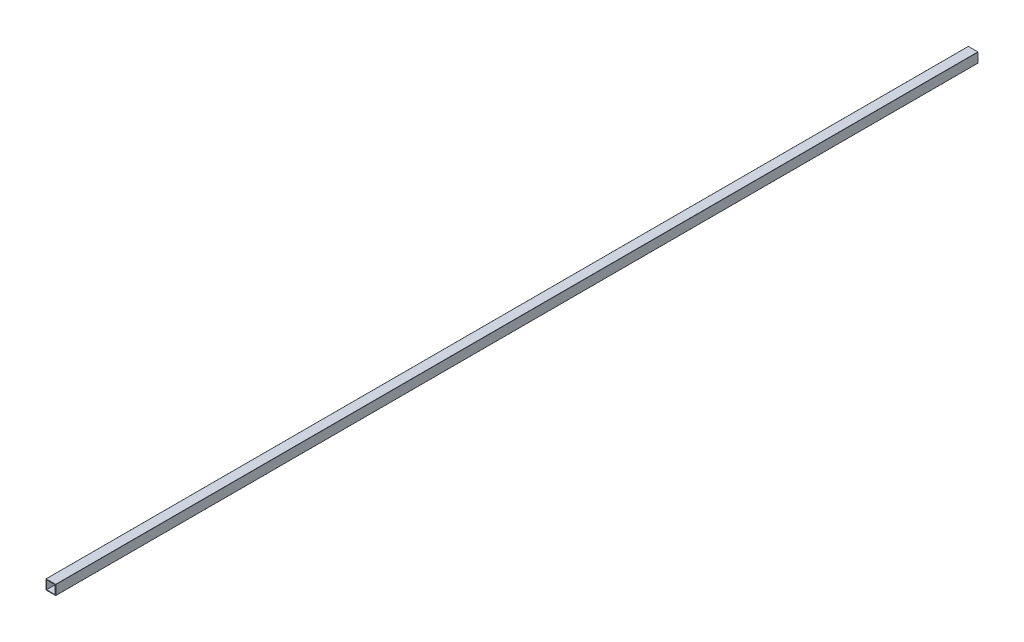
ISO-10303-21;
HEADER;
FILE_DESCRIPTION(('STEP AP214'),'2;1');
FILE_NAME('part.step','',(''),(''),'','','');
FILE_SCHEMA(('AUTOMOTIVE_DESIGN { 1 0 10303 214 1 1 1 1 }'));
ENDSEC;
DATA;
#1=APPLICATION_CONTEXT('core data for automotive mechanical design processes');
#2=APPLICATION_PROTOCOL_DEFINITION('international standard','automotive_design',2000,#1);
#3=PRODUCT_CONTEXT('',#1,'mechanical');
#4=PRODUCT('Part','Part','',(#3));
#5=PRODUCT_RELATED_PRODUCT_CATEGORY('part','',(#4));
#6=PRODUCT_DEFINITION_FORMATION('','',#4);
#7=PRODUCT_DEFINITION_CONTEXT('part definition',#1,'design');
#8=PRODUCT_DEFINITION('design','',#6,#7);
#9=PRODUCT_DEFINITION_SHAPE('','',#8);
#10=(LENGTH_UNIT() NAMED_UNIT(*) SI_UNIT(.MILLI.,.METRE.));
#11=(NAMED_UNIT(*) PLANE_ANGLE_UNIT() SI_UNIT($,.RADIAN.));
#12=(NAMED_UNIT(*) SI_UNIT($,.STERADIAN.) SOLID_ANGLE_UNIT());
#13=UNCERTAINTY_MEASURE_WITH_UNIT(LENGTH_MEASURE(1.E-05),#10,'distance_accuracy_value','');
#14=(GEOMETRIC_REPRESENTATION_CONTEXT(3) GLOBAL_UNCERTAINTY_ASSIGNED_CONTEXT((#13)) GLOBAL_UNIT_ASSIGNED_CONTEXT((#10,
#11,#12)) REPRESENTATION_CONTEXT('',''));
#15=CARTESIAN_POINT('',(0.,0.,0.));
#16=DIRECTION('',(0.,0.,1.));
#17=DIRECTION('',(1.,0.,0.));
#18=AXIS2_PLACEMENT_3D('',#15,#16,#17);
#19=CARTESIAN_POINT('',(30.75,30.75,6000.));
#20=DIRECTION('',(0.,0.,-1.));
#21=DIRECTION('',(-1.,0.,0.));
#22=AXIS2_PLACEMENT_3D('',#19,#20,#21);
#23=PLANE('',#22);
#24=CARTESIAN_POINT('',(30.75,30.75,6000.));
#25=DIRECTION('',(0.,0.,1.));
#26=DIRECTION('',(-1.,0.,0.));
#27=AXIS2_PLACEMENT_3D('',#24,#25,#26);
#28=CIRCLE('',#27,1.);
#29=CARTESIAN_POINT('',(31.75,30.75,6000.));
#30=VERTEX_POINT('',#29);
#31=CARTESIAN_POINT('',(30.75,31.75,6000.));
#32=VERTEX_POINT('',#31);
#33=EDGE_CURVE('E158',#30,#32,#28,.T.);
#34=ORIENTED_EDGE('',*,*,#33,.T.);
#35=DIRECTION('',(-1.,0.,0.));
#36=VECTOR('',#35,1.);
#37=CARTESIAN_POINT('',(-30.75,31.75,6000.));
#38=LINE('',#37,#36);
#39=CARTESIAN_POINT('',(-30.75,31.75,6000.));
#40=VERTEX_POINT('',#39);
#41=EDGE_CURVE('E161',#32,#40,#38,.T.);
#42=ORIENTED_EDGE('',*,*,#41,.T.);
#43=CARTESIAN_POINT('',(-30.75,30.75,6000.));
#44=DIRECTION('',(0.,0.,1.));
#45=DIRECTION('',(-1.,0.,0.));
#46=AXIS2_PLACEMENT_3D('',#43,#44,#45);
#47=CIRCLE('',#46,1.);
#48=CARTESIAN_POINT('',(-31.75,30.75,6000.));
#49=VERTEX_POINT('',#48);
#50=EDGE_CURVE('E164',#40,#49,#47,.T.);
#51=ORIENTED_EDGE('',*,*,#50,.T.);
#52=DIRECTION('',(0.,-1.,0.));
#53=VECTOR('',#52,1.);
#54=CARTESIAN_POINT('',(-31.75,-30.75,6000.));
#55=LINE('',#54,#53);
#56=CARTESIAN_POINT('',(-31.75,-30.75,6000.));
#57=VERTEX_POINT('',#56);
#58=EDGE_CURVE('E166',#49,#57,#55,.T.);
#59=ORIENTED_EDGE('',*,*,#58,.T.);
#60=CARTESIAN_POINT('',(-30.75,-30.75,6000.));
#61=DIRECTION('',(0.,0.,1.));
#62=DIRECTION('',(-1.,0.,0.));
#63=AXIS2_PLACEMENT_3D('',#60,#61,#62);
#64=CIRCLE('',#63,1.);
#65=CARTESIAN_POINT('',(-30.75,-31.75,6000.));
#66=VERTEX_POINT('',#65);
#67=EDGE_CURVE('E168',#57,#66,#64,.T.);
#68=ORIENTED_EDGE('',*,*,#67,.T.);
#69=DIRECTION('',(1.,0.,0.));
#70=VECTOR('',#69,1.);
#71=CARTESIAN_POINT('',(-30.75,-31.75,6000.));
#72=LINE('',#71,#70);
#73=CARTESIAN_POINT('',(30.75,-31.75,6000.));
#74=VERTEX_POINT('',#73);
#75=EDGE_CURVE('E170',#66,#74,#72,.T.);
#76=ORIENTED_EDGE('',*,*,#75,.T.);
#77=CARTESIAN_POINT('',(30.75,-30.75,6000.));
#78=DIRECTION('',(0.,0.,1.));
#79=DIRECTION('',(1.,0.,0.));
#80=AXIS2_PLACEMENT_3D('',#77,#78,#79);
#81=CIRCLE('',#80,1.);
#82=CARTESIAN_POINT('',(31.75,-30.75,6000.));
#83=VERTEX_POINT('',#82);
#84=EDGE_CURVE('E172',#74,#83,#81,.T.);
#85=ORIENTED_EDGE('',*,*,#84,.T.);
#86=DIRECTION('',(0.,1.,0.));
#87=VECTOR('',#86,1.);
#88=CARTESIAN_POINT('',(31.75,-30.75,6000.));
#89=LINE('',#88,#87);
#90=EDGE_CURVE('E174',#83,#30,#89,.T.);
#91=ORIENTED_EDGE('',*,*,#90,.T.);
#92=EDGE_LOOP('',(#34,#42,#51,#59,#68,#76,#85,#91));
#93=FACE_BOUND('',#92,.T.);
#94=DIRECTION('',(1.,0.,0.));
#95=VECTOR('',#94,1.);
#96=CARTESIAN_POINT('',(-27.95,-27.95,6000.));
#97=LINE('',#96,#95);
#98=CARTESIAN_POINT('',(-27.95,-27.95,6000.));
#99=VERTEX_POINT('',#98);
#100=CARTESIAN_POINT('',(27.95,-27.95,6000.));
#101=VERTEX_POINT('',#100);
#102=EDGE_CURVE('E122',#99,#101,#97,.T.);
#103=ORIENTED_EDGE('',*,*,#102,.F.);
#104=DIRECTION('',(0.,-1.,0.));
#105=VECTOR('',#104,1.);
#106=CARTESIAN_POINT('',(-27.95,-27.95,6000.));
#107=LINE('',#106,#105);
#108=CARTESIAN_POINT('',(-27.95,27.95,6000.));
#109=VERTEX_POINT('',#108);
#110=EDGE_CURVE('E144',#109,#99,#107,.T.);
#111=ORIENTED_EDGE('',*,*,#110,.F.);
#112=DIRECTION('',(-1.,0.,0.));
#113=VECTOR('',#112,1.);
#114=CARTESIAN_POINT('',(-27.95,27.95,6000.));
#115=LINE('',#114,#113);
#116=CARTESIAN_POINT('',(27.95,27.95,6000.));
#117=VERTEX_POINT('',#116);
#118=EDGE_CURVE('E142',#117,#109,#115,.T.);
#119=ORIENTED_EDGE('',*,*,#118,.F.);
#120=DIRECTION('',(0.,1.,0.));
#121=VECTOR('',#120,1.);
#122=CARTESIAN_POINT('',(27.95,-27.95,6000.));
#123=LINE('',#122,#121);
#124=EDGE_CURVE('E130',#101,#117,#123,.T.);
#125=ORIENTED_EDGE('',*,*,#124,.F.);
#126=EDGE_LOOP('',(#103,#111,#119,#125));
#127=FACE_BOUND('',#126,.T.);
#128=ADVANCED_FACE('F33',(#93,#127),#23,.F.);
#129=CARTESIAN_POINT('',(30.75,30.75,0.));
#130=DIRECTION('',(0.,0.,-1.));
#131=DIRECTION('',(-1.,0.,0.));
#132=AXIS2_PLACEMENT_3D('',#129,#130,#131);
#133=PLANE('',#132);
#134=CARTESIAN_POINT('',(30.75,30.75,0.));
#135=DIRECTION('',(0.,0.,1.));
#136=DIRECTION('',(-1.,0.,0.));
#137=AXIS2_PLACEMENT_3D('',#134,#135,#136);
#138=CIRCLE('',#137,1.);
#139=CARTESIAN_POINT('',(31.75,30.75,0.));
#140=VERTEX_POINT('',#139);
#141=CARTESIAN_POINT('',(30.75,31.75,0.));
#142=VERTEX_POINT('',#141);
#143=EDGE_CURVE('E138',#140,#142,#138,.T.);
#144=ORIENTED_EDGE('',*,*,#143,.F.);
#145=DIRECTION('',(0.,1.,0.));
#146=VECTOR('',#145,1.);
#147=CARTESIAN_POINT('',(31.75,-30.75,0.));
#148=LINE('',#147,#146);
#149=CARTESIAN_POINT('',(31.75,-30.75,0.));
#150=VERTEX_POINT('',#149);
#151=EDGE_CURVE('E162',#150,#140,#148,.T.);
#152=ORIENTED_EDGE('',*,*,#151,.F.);
#153=CARTESIAN_POINT('',(30.75,-30.75,0.));
#154=DIRECTION('',(0.,0.,1.));
#155=DIRECTION('',(1.,0.,0.));
#156=AXIS2_PLACEMENT_3D('',#153,#154,#155);
#157=CIRCLE('',#156,1.);
#158=CARTESIAN_POINT('',(30.75,-31.75,0.));
#159=VERTEX_POINT('',#158);
#160=EDGE_CURVE('E189',#159,#150,#157,.T.);
#161=ORIENTED_EDGE('',*,*,#160,.F.);
#162=DIRECTION('',(1.,0.,0.));
#163=VECTOR('',#162,1.);
#164=CARTESIAN_POINT('',(-30.75,-31.75,0.));
#165=LINE('',#164,#163);
#166=CARTESIAN_POINT('',(-30.75,-31.75,0.));
#167=VERTEX_POINT('',#166);
#168=EDGE_CURVE('E187',#167,#159,#165,.T.);
#169=ORIENTED_EDGE('',*,*,#168,.F.);
#170=CARTESIAN_POINT('',(-30.75,-30.75,0.));
#171=DIRECTION('',(0.,0.,1.));
#172=DIRECTION('',(-1.,0.,0.));
#173=AXIS2_PLACEMENT_3D('',#170,#171,#172);
#174=CIRCLE('',#173,1.);
#175=CARTESIAN_POINT('',(-31.75,-30.75,0.));
#176=VERTEX_POINT('',#175);
#177=EDGE_CURVE('E185',#176,#167,#174,.T.);
#178=ORIENTED_EDGE('',*,*,#177,.F.);
#179=DIRECTION('',(0.,-1.,0.));
#180=VECTOR('',#179,1.);
#181=CARTESIAN_POINT('',(-31.75,-30.75,0.));
#182=LINE('',#181,#180);
#183=CARTESIAN_POINT('',(-31.75,30.75,0.));
#184=VERTEX_POINT('',#183);
#185=EDGE_CURVE('E183',#184,#176,#182,.T.);
#186=ORIENTED_EDGE('',*,*,#185,.F.);
#187=CARTESIAN_POINT('',(-30.75,30.75,0.));
#188=DIRECTION('',(0.,0.,1.));
#189=DIRECTION('',(-1.,0.,0.));
#190=AXIS2_PLACEMENT_3D('',#187,#188,#189);
#191=CIRCLE('',#190,1.);
#192=CARTESIAN_POINT('',(-30.75,31.75,0.));
#193=VERTEX_POINT('',#192);
#194=EDGE_CURVE('E181',#193,#184,#191,.T.);
#195=ORIENTED_EDGE('',*,*,#194,.F.);
#196=DIRECTION('',(-1.,0.,0.));
#197=VECTOR('',#196,1.);
#198=CARTESIAN_POINT('',(-30.75,31.75,0.));
#199=LINE('',#198,#197);
#200=EDGE_CURVE('E179',#142,#193,#199,.T.);
#201=ORIENTED_EDGE('',*,*,#200,.F.);
#202=EDGE_LOOP('',(#144,#152,#161,#169,#178,#186,#195,#201));
#203=FACE_BOUND('',#202,.T.);
#204=DIRECTION('',(0.,-1.,0.));
#205=VECTOR('',#204,1.);
#206=CARTESIAN_POINT('',(-27.95,-27.95,0.));
#207=LINE('',#206,#205);
#208=CARTESIAN_POINT('',(-27.95,27.95,0.));
#209=VERTEX_POINT('',#208);
#210=CARTESIAN_POINT('',(-27.95,-27.95,0.));
#211=VERTEX_POINT('',#210);
#212=EDGE_CURVE('E131',#209,#211,#207,.T.);
#213=ORIENTED_EDGE('',*,*,#212,.T.);
#214=DIRECTION('',(1.,0.,0.));
#215=VECTOR('',#214,1.);
#216=CARTESIAN_POINT('',(-27.95,-27.95,0.));
#217=LINE('',#216,#215);
#218=CARTESIAN_POINT('',(27.95,-27.95,0.));
#219=VERTEX_POINT('',#218);
#220=EDGE_CURVE('E56',#211,#219,#217,.T.);
#221=ORIENTED_EDGE('',*,*,#220,.T.);
#222=DIRECTION('',(0.,1.,0.));
#223=VECTOR('',#222,1.);
#224=CARTESIAN_POINT('',(27.95,-27.95,0.));
#225=LINE('',#224,#223);
#226=CARTESIAN_POINT('',(27.95,27.95,0.));
#227=VERTEX_POINT('',#226);
#228=EDGE_CURVE('E137',#219,#227,#225,.T.);
#229=ORIENTED_EDGE('',*,*,#228,.T.);
#230=DIRECTION('',(-1.,0.,0.));
#231=VECTOR('',#230,1.);
#232=CARTESIAN_POINT('',(-27.95,27.95,0.));
#233=LINE('',#232,#231);
#234=EDGE_CURVE('E150',#227,#209,#233,.T.);
#235=ORIENTED_EDGE('',*,*,#234,.T.);
#236=EDGE_LOOP('',(#213,#221,#229,#235));
#237=FACE_BOUND('',#236,.T.);
#238=ADVANCED_FACE('F219',(#203,#237),#133,.T.);
#239=CARTESIAN_POINT('',(30.75,30.75,6000.));
#240=DIRECTION('',(0.,0.,-1.));
#241=DIRECTION('',(-1.,0.,0.));
#242=AXIS2_PLACEMENT_3D('',#239,#240,#241);
#243=CYLINDRICAL_SURFACE('',#242,1.);
#244=ORIENTED_EDGE('',*,*,#143,.T.);
#245=DIRECTION('',(0.,0.,-1.));
#246=VECTOR('',#245,1.);
#247=CARTESIAN_POINT('',(30.75,31.75,6000.));
#248=LINE('',#247,#246);
#249=EDGE_CURVE('E11',#32,#142,#248,.T.);
#250=ORIENTED_EDGE('',*,*,#249,.F.);
#251=ORIENTED_EDGE('',*,*,#33,.F.);
#252=DIRECTION('',(0.,0.,-1.));
#253=VECTOR('',#252,1.);
#254=CARTESIAN_POINT('',(31.75,30.75,6000.));
#255=LINE('',#254,#253);
#256=EDGE_CURVE('E176',#30,#140,#255,.T.);
#257=ORIENTED_EDGE('',*,*,#256,.T.);
#258=EDGE_LOOP('',(#244,#250,#251,#257));
#259=FACE_BOUND('',#258,.T.);
#260=ADVANCED_FACE('F35',(#259),#243,.T.);
#261=CARTESIAN_POINT('',(-30.75,31.75,6000.));
#262=DIRECTION('',(0.,-1.,0.));
#263=DIRECTION('',(0.,0.,-1.));
#264=AXIS2_PLACEMENT_3D('',#261,#262,#263);
#265=PLANE('',#264);
#266=ORIENTED_EDGE('',*,*,#200,.T.);
#267=DIRECTION('',(0.,0.,-1.));
#268=VECTOR('',#267,1.);
#269=CARTESIAN_POINT('',(-30.75,31.75,6000.));
#270=LINE('',#269,#268);
#271=EDGE_CURVE('E41',#40,#193,#270,.T.);
#272=ORIENTED_EDGE('',*,*,#271,.F.);
#273=ORIENTED_EDGE('',*,*,#41,.F.);
#274=ORIENTED_EDGE('',*,*,#249,.T.);
#275=EDGE_LOOP('',(#266,#272,#273,#274));
#276=FACE_BOUND('',#275,.T.);
#277=ADVANCED_FACE('F236',(#276),#265,.F.);
#278=CARTESIAN_POINT('',(-30.75,30.75,6000.));
#279=DIRECTION('',(0.,0.,-1.));
#280=DIRECTION('',(-1.,0.,0.));
#281=AXIS2_PLACEMENT_3D('',#278,#279,#280);
#282=CYLINDRICAL_SURFACE('',#281,1.);
#283=ORIENTED_EDGE('',*,*,#194,.T.);
#284=DIRECTION('',(0.,0.,-1.));
#285=VECTOR('',#284,1.);
#286=CARTESIAN_POINT('',(-31.75,30.75,6000.));
#287=LINE('',#286,#285);
#288=EDGE_CURVE('E206',#49,#184,#287,.T.);
#289=ORIENTED_EDGE('',*,*,#288,.F.);
#290=ORIENTED_EDGE('',*,*,#50,.F.);
#291=ORIENTED_EDGE('',*,*,#271,.T.);
#292=EDGE_LOOP('',(#283,#289,#290,#291));
#293=FACE_BOUND('',#292,.T.);
#294=ADVANCED_FACE('F213',(#293),#282,.T.);
#295=CARTESIAN_POINT('',(-31.75,-30.75,6000.));
#296=DIRECTION('',(1.,0.,0.));
#297=DIRECTION('',(0.,0.,-1.));
#298=AXIS2_PLACEMENT_3D('',#295,#296,#297);
#299=PLANE('',#298);
#300=ORIENTED_EDGE('',*,*,#185,.T.);
#301=DIRECTION('',(0.,0.,-1.));
#302=VECTOR('',#301,1.);
#303=CARTESIAN_POINT('',(-31.75,-30.75,6000.));
#304=LINE('',#303,#302);
#305=EDGE_CURVE('E203',#57,#176,#304,.T.);
#306=ORIENTED_EDGE('',*,*,#305,.F.);
#307=ORIENTED_EDGE('',*,*,#58,.F.);
#308=ORIENTED_EDGE('',*,*,#288,.T.);
#309=EDGE_LOOP('',(#300,#306,#307,#308));
#310=FACE_BOUND('',#309,.T.);
#311=ADVANCED_FACE('F225',(#310),#299,.F.);
#312=CARTESIAN_POINT('',(-30.75,-30.75,6000.));
#313=DIRECTION('',(0.,0.,-1.));
#314=DIRECTION('',(-1.,0.,0.));
#315=AXIS2_PLACEMENT_3D('',#312,#313,#314);
#316=CYLINDRICAL_SURFACE('',#315,1.);
#317=ORIENTED_EDGE('',*,*,#177,.T.);
#318=DIRECTION('',(0.,0.,-1.));
#319=VECTOR('',#318,1.);
#320=CARTESIAN_POINT('',(-30.75,-31.75,6000.));
#321=LINE('',#320,#319);
#322=EDGE_CURVE('E200',#66,#167,#321,.T.);
#323=ORIENTED_EDGE('',*,*,#322,.F.);
#324=ORIENTED_EDGE('',*,*,#67,.F.);
#325=ORIENTED_EDGE('',*,*,#305,.T.);
#326=EDGE_LOOP('',(#317,#323,#324,#325));
#327=FACE_BOUND('',#326,.T.);
#328=ADVANCED_FACE('F229',(#327),#316,.T.);
#329=CARTESIAN_POINT('',(-30.75,-31.75,6000.));
#330=DIRECTION('',(0.,1.,0.));
#331=DIRECTION('',(0.,0.,1.));
#332=AXIS2_PLACEMENT_3D('',#329,#330,#331);
#333=PLANE('',#332);
#334=ORIENTED_EDGE('',*,*,#168,.T.);
#335=DIRECTION('',(0.,0.,-1.));
#336=VECTOR('',#335,1.);
#337=CARTESIAN_POINT('',(30.75,-31.75,6000.));
#338=LINE('',#337,#336);
#339=EDGE_CURVE('E197',#74,#159,#338,.T.);
#340=ORIENTED_EDGE('',*,*,#339,.F.);
#341=ORIENTED_EDGE('',*,*,#75,.F.);
#342=ORIENTED_EDGE('',*,*,#322,.T.);
#343=EDGE_LOOP('',(#334,#340,#341,#342));
#344=FACE_BOUND('',#343,.T.);
#345=ADVANCED_FACE('F249',(#344),#333,.F.);
#346=CARTESIAN_POINT('',(30.75,-30.75,6000.));
#347=DIRECTION('',(0.,0.,-1.));
#348=DIRECTION('',(-1.,0.,0.));
#349=AXIS2_PLACEMENT_3D('',#346,#347,#348);
#350=CYLINDRICAL_SURFACE('',#349,1.);
#351=ORIENTED_EDGE('',*,*,#160,.T.);
#352=DIRECTION('',(0.,0.,-1.));
#353=VECTOR('',#352,1.);
#354=CARTESIAN_POINT('',(31.75,-30.75,6000.));
#355=LINE('',#354,#353);
#356=EDGE_CURVE('E194',#83,#150,#355,.T.);
#357=ORIENTED_EDGE('',*,*,#356,.F.);
#358=ORIENTED_EDGE('',*,*,#84,.F.);
#359=ORIENTED_EDGE('',*,*,#339,.T.);
#360=EDGE_LOOP('',(#351,#357,#358,#359));
#361=FACE_BOUND('',#360,.T.);
#362=ADVANCED_FACE('F247',(#361),#350,.T.);
#363=CARTESIAN_POINT('',(31.75,-30.75,6000.));
#364=DIRECTION('',(-1.,0.,0.));
#365=DIRECTION('',(0.,0.,1.));
#366=AXIS2_PLACEMENT_3D('',#363,#364,#365);
#367=PLANE('',#366);
#368=ORIENTED_EDGE('',*,*,#151,.T.);
#369=ORIENTED_EDGE('',*,*,#256,.F.);
#370=ORIENTED_EDGE('',*,*,#90,.F.);
#371=ORIENTED_EDGE('',*,*,#356,.T.);
#372=EDGE_LOOP('',(#368,#369,#370,#371));
#373=FACE_BOUND('',#372,.T.);
#374=ADVANCED_FACE('F242',(#373),#367,.F.);
#375=CARTESIAN_POINT('',(-27.95,-27.95,6000.));
#376=DIRECTION('',(0.,1.,0.));
#377=DIRECTION('',(0.,0.,1.));
#378=AXIS2_PLACEMENT_3D('',#375,#376,#377);
#379=PLANE('',#378);
#380=ORIENTED_EDGE('',*,*,#220,.F.);
#381=DIRECTION('',(0.,0.,-1.));
#382=VECTOR('',#381,1.);
#383=CARTESIAN_POINT('',(-27.95,-27.95,6000.));
#384=LINE('',#383,#382);
#385=EDGE_CURVE('E126',#99,#211,#384,.T.);
#386=ORIENTED_EDGE('',*,*,#385,.F.);
#387=ORIENTED_EDGE('',*,*,#102,.T.);
#388=DIRECTION('',(0.,0.,-1.));
#389=VECTOR('',#388,1.);
#390=CARTESIAN_POINT('',(27.95,-27.95,6000.));
#391=LINE('',#390,#389);
#392=EDGE_CURVE('E125',#101,#219,#391,.T.);
#393=ORIENTED_EDGE('',*,*,#392,.T.);
#394=EDGE_LOOP('',(#380,#386,#387,#393));
#395=FACE_BOUND('',#394,.T.);
#396=ADVANCED_FACE('F124',(#395),#379,.T.);
#397=CARTESIAN_POINT('',(27.95,-27.95,6000.));
#398=DIRECTION('',(-1.,0.,0.));
#399=DIRECTION('',(0.,-1.,0.));
#400=AXIS2_PLACEMENT_3D('',#397,#398,#399);
#401=PLANE('',#400);
#402=ORIENTED_EDGE('',*,*,#228,.F.);
#403=ORIENTED_EDGE('',*,*,#392,.F.);
#404=ORIENTED_EDGE('',*,*,#124,.T.);
#405=DIRECTION('',(0.,0.,-1.));
#406=VECTOR('',#405,1.);
#407=CARTESIAN_POINT('',(27.95,27.95,6000.));
#408=LINE('',#407,#406);
#409=EDGE_CURVE('E139',#117,#227,#408,.T.);
#410=ORIENTED_EDGE('',*,*,#409,.T.);
#411=EDGE_LOOP('',(#402,#403,#404,#410));
#412=FACE_BOUND('',#411,.T.);
#413=ADVANCED_FACE('F134',(#412),#401,.T.);
#414=CARTESIAN_POINT('',(-27.95,27.95,6000.));
#415=DIRECTION('',(0.,-1.,0.));
#416=DIRECTION('',(1.,0.,0.));
#417=AXIS2_PLACEMENT_3D('',#414,#415,#416);
#418=PLANE('',#417);
#419=ORIENTED_EDGE('',*,*,#234,.F.);
#420=ORIENTED_EDGE('',*,*,#409,.F.);
#421=ORIENTED_EDGE('',*,*,#118,.T.);
#422=DIRECTION('',(0.,0.,-1.));
#423=VECTOR('',#422,1.);
#424=CARTESIAN_POINT('',(-27.95,27.95,6000.));
#425=LINE('',#424,#423);
#426=EDGE_CURVE('E48',#109,#209,#425,.T.);
#427=ORIENTED_EDGE('',*,*,#426,.T.);
#428=EDGE_LOOP('',(#419,#420,#421,#427));
#429=FACE_BOUND('',#428,.T.);
#430=ADVANCED_FACE('F274',(#429),#418,.T.);
#431=CARTESIAN_POINT('',(-27.95,-27.95,6000.));
#432=DIRECTION('',(1.,0.,0.));
#433=DIRECTION('',(0.,0.,-1.));
#434=AXIS2_PLACEMENT_3D('',#431,#432,#433);
#435=PLANE('',#434);
#436=ORIENTED_EDGE('',*,*,#212,.F.);
#437=ORIENTED_EDGE('',*,*,#426,.F.);
#438=ORIENTED_EDGE('',*,*,#110,.T.);
#439=ORIENTED_EDGE('',*,*,#385,.T.);
#440=EDGE_LOOP('',(#436,#437,#438,#439));
#441=FACE_BOUND('',#440,.T.);
#442=ADVANCED_FACE('F278',(#441),#435,.T.);
#443=CLOSED_SHELL('',(#128,#238,#260,#277,#294,#311,#328,#345,#362,#374,#396,#413,#430,#442));
#444=MANIFOLD_SOLID_BREP('B2',#443);
#445=ADVANCED_BREP_SHAPE_REPRESENTATION('',(#18,#444),#14);
#446=SHAPE_DEFINITION_REPRESENTATION(#9,#445);
ENDSEC;
END-ISO-10303-21;
